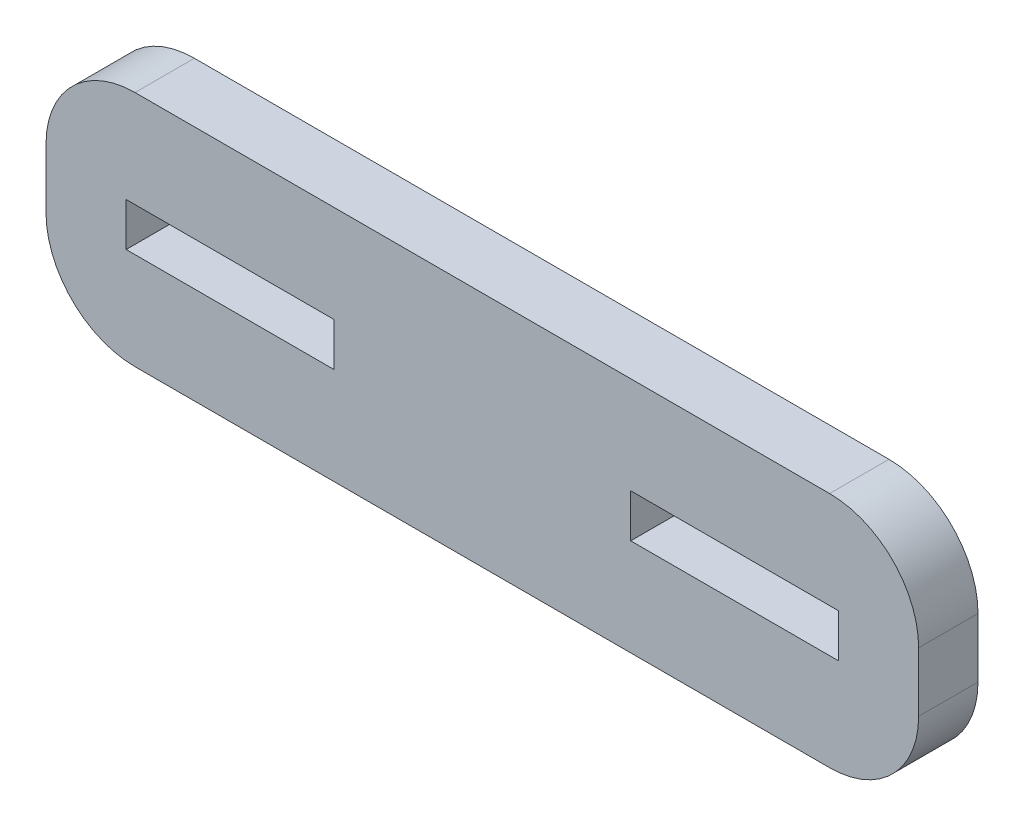
ISO-10303-21;
HEADER;
FILE_DESCRIPTION(('STEP AP214'),'2;1');
FILE_NAME('part.step','',(''),(''),'','','');
FILE_SCHEMA(('AUTOMOTIVE_DESIGN { 1 0 10303 214 1 1 1 1 }'));
ENDSEC;
DATA;
#1=APPLICATION_CONTEXT('core data for automotive mechanical design processes');
#2=APPLICATION_PROTOCOL_DEFINITION('international standard','automotive_design',2000,#1);
#3=PRODUCT_CONTEXT('',#1,'mechanical');
#4=PRODUCT('Part','Part','',(#3));
#5=PRODUCT_RELATED_PRODUCT_CATEGORY('part','',(#4));
#6=PRODUCT_DEFINITION_FORMATION('','',#4);
#7=PRODUCT_DEFINITION_CONTEXT('part definition',#1,'design');
#8=PRODUCT_DEFINITION('design','',#6,#7);
#9=PRODUCT_DEFINITION_SHAPE('','',#8);
#10=(LENGTH_UNIT() NAMED_UNIT(*) SI_UNIT(.MILLI.,.METRE.));
#11=(NAMED_UNIT(*) PLANE_ANGLE_UNIT() SI_UNIT($,.RADIAN.));
#12=(NAMED_UNIT(*) SI_UNIT($,.STERADIAN.) SOLID_ANGLE_UNIT());
#13=UNCERTAINTY_MEASURE_WITH_UNIT(LENGTH_MEASURE(1.E-05),#10,'distance_accuracy_value','');
#14=(GEOMETRIC_REPRESENTATION_CONTEXT(3) GLOBAL_UNCERTAINTY_ASSIGNED_CONTEXT((#13)) GLOBAL_UNIT_ASSIGNED_CONTEXT((#10,
#11,#12)) REPRESENTATION_CONTEXT('',''));
#15=CARTESIAN_POINT('',(0.,0.,0.));
#16=DIRECTION('',(0.,0.,1.));
#17=DIRECTION('',(1.,0.,0.));
#18=AXIS2_PLACEMENT_3D('',#15,#16,#17);
#19=CARTESIAN_POINT('',(-7.66454497858933,24.7840098446599,2.));
#20=DIRECTION('',(0.,0.,-1.));
#21=DIRECTION('',(-1.,0.,0.));
#22=AXIS2_PLACEMENT_3D('',#19,#20,#21);
#23=PLANE('',#22);
#24=DIRECTION('',(0.,-1.,0.));
#25=VECTOR('',#24,1.);
#26=CARTESIAN_POINT('',(-31.3645449785893,24.5140098446599,2.));
#27=LINE('',#26,#25);
#28=CARTESIAN_POINT('',(-31.3645449785893,24.5140098446599,2.));
#29=VERTEX_POINT('',#28);
#30=CARTESIAN_POINT('',(-31.3645449785893,23.0540098446599,2.));
#31=VERTEX_POINT('',#30);
#32=EDGE_CURVE('E200',#29,#31,#27,.T.);
#33=ORIENTED_EDGE('',*,*,#32,.F.);
#34=DIRECTION('',(-1.,0.,0.));
#35=VECTOR('',#34,1.);
#36=CARTESIAN_POINT('',(-31.3645449785893,24.5140098446599,2.));
#37=LINE('',#36,#35);
#38=CARTESIAN_POINT('',(-24.3645449785893,24.5140098446599,2.));
#39=VERTEX_POINT('',#38);
#40=EDGE_CURVE('E211',#39,#29,#37,.T.);
#41=ORIENTED_EDGE('',*,*,#40,.F.);
#42=DIRECTION('',(0.,1.,0.));
#43=VECTOR('',#42,1.);
#44=CARTESIAN_POINT('',(-24.3645449785893,24.5140098446599,2.));
#45=LINE('',#44,#43);
#46=CARTESIAN_POINT('',(-24.3645449785893,23.0540098446599,2.));
#47=VERTEX_POINT('',#46);
#48=EDGE_CURVE('E207',#47,#39,#45,.T.);
#49=ORIENTED_EDGE('',*,*,#48,.F.);
#50=DIRECTION('',(1.,0.,0.));
#51=VECTOR('',#50,1.);
#52=CARTESIAN_POINT('',(-31.3645449785893,23.0540098446599,2.));
#53=LINE('',#52,#51);
#54=EDGE_CURVE('E203',#31,#47,#53,.T.);
#55=ORIENTED_EDGE('',*,*,#54,.F.);
#56=EDGE_LOOP('',(#33,#41,#49,#55));
#57=FACE_BOUND('',#56,.T.);
#58=CARTESIAN_POINT('',(-7.66454497858933,24.7840098446599,2.));
#59=DIRECTION('',(0.,0.,1.));
#60=DIRECTION('',(-1.,0.,0.));
#61=AXIS2_PLACEMENT_3D('',#58,#59,#60);
#62=CIRCLE('',#61,3.);
#63=CARTESIAN_POINT('',(-4.66454497858933,24.7840098446599,2.));
#64=VERTEX_POINT('',#63);
#65=CARTESIAN_POINT('',(-7.66454497858935,27.7840098446599,2.));
#66=VERTEX_POINT('',#65);
#67=EDGE_CURVE('E243',#64,#66,#62,.T.);
#68=ORIENTED_EDGE('',*,*,#67,.T.);
#69=DIRECTION('',(-1.,0.,0.));
#70=VECTOR('',#69,1.);
#71=CARTESIAN_POINT('',(-31.0645449785893,27.7840098446599,2.));
#72=LINE('',#71,#70);
#73=CARTESIAN_POINT('',(-31.0645449785893,27.7840098446599,2.));
#74=VERTEX_POINT('',#73);
#75=EDGE_CURVE('E247',#66,#74,#72,.T.);
#76=ORIENTED_EDGE('',*,*,#75,.T.);
#77=CARTESIAN_POINT('',(-31.0645449785893,24.7840098446599,2.));
#78=DIRECTION('',(0.,0.,1.));
#79=DIRECTION('',(1.,0.,0.));
#80=AXIS2_PLACEMENT_3D('',#77,#78,#79);
#81=CIRCLE('',#80,3.);
#82=CARTESIAN_POINT('',(-34.0645449785893,24.7840098446599,2.));
#83=VERTEX_POINT('',#82);
#84=EDGE_CURVE('E251',#74,#83,#81,.T.);
#85=ORIENTED_EDGE('',*,*,#84,.T.);
#86=DIRECTION('',(0.,-1.,0.));
#87=VECTOR('',#86,1.);
#88=CARTESIAN_POINT('',(-34.0645449785893,24.7840098446599,2.));
#89=LINE('',#88,#87);
#90=CARTESIAN_POINT('',(-34.0645449785893,22.7840098446599,2.));
#91=VERTEX_POINT('',#90);
#92=EDGE_CURVE('E254',#83,#91,#89,.T.);
#93=ORIENTED_EDGE('',*,*,#92,.T.);
#94=CARTESIAN_POINT('',(-31.0645449785893,22.7840098446599,2.));
#95=DIRECTION('',(0.,0.,1.));
#96=DIRECTION('',(1.,0.,0.));
#97=AXIS2_PLACEMENT_3D('',#94,#95,#96);
#98=CIRCLE('',#97,3.);
#99=CARTESIAN_POINT('',(-31.0645449785893,19.7840098446599,2.));
#100=VERTEX_POINT('',#99);
#101=EDGE_CURVE('E257',#91,#100,#98,.T.);
#102=ORIENTED_EDGE('',*,*,#101,.T.);
#103=DIRECTION('',(1.,0.,0.));
#104=VECTOR('',#103,1.);
#105=CARTESIAN_POINT('',(-31.0645449785893,19.7840098446599,2.));
#106=LINE('',#105,#104);
#107=CARTESIAN_POINT('',(-7.66454497858935,19.7840098446599,2.));
#108=VERTEX_POINT('',#107);
#109=EDGE_CURVE('E260',#100,#108,#106,.T.);
#110=ORIENTED_EDGE('',*,*,#109,.T.);
#111=CARTESIAN_POINT('',(-7.66454497858933,22.7840098446599,2.));
#112=DIRECTION('',(0.,0.,1.));
#113=DIRECTION('',(1.,0.,0.));
#114=AXIS2_PLACEMENT_3D('',#111,#112,#113);
#115=CIRCLE('',#114,3.);
#116=CARTESIAN_POINT('',(-4.66454497858933,22.7840098446599,2.));
#117=VERTEX_POINT('',#116);
#118=EDGE_CURVE('E263',#108,#117,#115,.T.);
#119=ORIENTED_EDGE('',*,*,#118,.T.);
#120=DIRECTION('',(0.,1.,0.));
#121=VECTOR('',#120,1.);
#122=CARTESIAN_POINT('',(-4.66454497858933,24.7840098446599,2.));
#123=LINE('',#122,#121);
#124=EDGE_CURVE('E266',#117,#64,#123,.T.);
#125=ORIENTED_EDGE('',*,*,#124,.T.);
#126=EDGE_LOOP('',(#68,#76,#85,#93,#102,#110,#119,#125));
#127=FACE_BOUND('',#126,.T.);
#128=DIRECTION('',(0.,-1.,0.));
#129=VECTOR('',#128,1.);
#130=CARTESIAN_POINT('',(-14.3645449785893,24.5140098446599,2.));
#131=LINE('',#130,#129);
#132=CARTESIAN_POINT('',(-14.3645449785893,24.5140098446599,2.));
#133=VERTEX_POINT('',#132);
#134=CARTESIAN_POINT('',(-14.3645449785893,23.0540098446599,2.));
#135=VERTEX_POINT('',#134);
#136=EDGE_CURVE('E152',#133,#135,#131,.T.);
#137=ORIENTED_EDGE('',*,*,#136,.F.);
#138=DIRECTION('',(-1.,0.,0.));
#139=VECTOR('',#138,1.);
#140=CARTESIAN_POINT('',(-14.3645449785893,24.5140098446599,2.));
#141=LINE('',#140,#139);
#142=CARTESIAN_POINT('',(-7.36454497858933,24.5140098446599,2.));
#143=VERTEX_POINT('',#142);
#144=EDGE_CURVE('E178',#143,#133,#141,.T.);
#145=ORIENTED_EDGE('',*,*,#144,.F.);
#146=DIRECTION('',(0.,1.,0.));
#147=VECTOR('',#146,1.);
#148=CARTESIAN_POINT('',(-7.36454497858933,24.5140098446599,2.));
#149=LINE('',#148,#147);
#150=CARTESIAN_POINT('',(-7.36454497858933,23.0540098446599,2.));
#151=VERTEX_POINT('',#150);
#152=EDGE_CURVE('E174',#151,#143,#149,.T.);
#153=ORIENTED_EDGE('',*,*,#152,.F.);
#154=DIRECTION('',(1.,0.,0.));
#155=VECTOR('',#154,1.);
#156=CARTESIAN_POINT('',(-14.3645449785893,23.0540098446599,2.));
#157=LINE('',#156,#155);
#158=EDGE_CURVE('E161',#135,#151,#157,.T.);
#159=ORIENTED_EDGE('',*,*,#158,.F.);
#160=EDGE_LOOP('',(#137,#145,#153,#159));
#161=FACE_BOUND('',#160,.T.);
#162=ADVANCED_FACE('F38',(#57,#127,#161),#23,.F.);
#163=CARTESIAN_POINT('',(-7.66454497858933,24.7840098446599,0.));
#164=DIRECTION('',(0.,0.,-1.));
#165=DIRECTION('',(-1.,0.,0.));
#166=AXIS2_PLACEMENT_3D('',#163,#164,#165);
#167=PLANE('',#166);
#168=CARTESIAN_POINT('',(-7.66454497858933,24.7840098446599,0.));
#169=DIRECTION('',(0.,0.,1.));
#170=DIRECTION('',(-1.,0.,0.));
#171=AXIS2_PLACEMENT_3D('',#168,#169,#170);
#172=CIRCLE('',#171,3.);
#173=CARTESIAN_POINT('',(-4.66454497858933,24.7840098446599,0.));
#174=VERTEX_POINT('',#173);
#175=CARTESIAN_POINT('',(-7.66454497858935,27.7840098446599,0.));
#176=VERTEX_POINT('',#175);
#177=EDGE_CURVE('E242',#174,#176,#172,.T.);
#178=ORIENTED_EDGE('',*,*,#177,.F.);
#179=DIRECTION('',(0.,1.,0.));
#180=VECTOR('',#179,1.);
#181=CARTESIAN_POINT('',(-4.66454497858933,24.7840098446599,0.));
#182=LINE('',#181,#180);
#183=CARTESIAN_POINT('',(-4.66454497858933,22.7840098446599,0.));
#184=VERTEX_POINT('',#183);
#185=EDGE_CURVE('E248',#184,#174,#182,.T.);
#186=ORIENTED_EDGE('',*,*,#185,.F.);
#187=CARTESIAN_POINT('',(-7.66454497858933,22.7840098446599,0.));
#188=DIRECTION('',(0.,0.,1.));
#189=DIRECTION('',(1.,0.,0.));
#190=AXIS2_PLACEMENT_3D('',#187,#188,#189);
#191=CIRCLE('',#190,3.);
#192=CARTESIAN_POINT('',(-7.66454497858935,19.7840098446599,0.));
#193=VERTEX_POINT('',#192);
#194=EDGE_CURVE('E288',#193,#184,#191,.T.);
#195=ORIENTED_EDGE('',*,*,#194,.F.);
#196=DIRECTION('',(1.,0.,0.));
#197=VECTOR('',#196,1.);
#198=CARTESIAN_POINT('',(-31.0645449785893,19.7840098446599,0.));
#199=LINE('',#198,#197);
#200=CARTESIAN_POINT('',(-31.0645449785893,19.7840098446599,0.));
#201=VERTEX_POINT('',#200);
#202=EDGE_CURVE('E285',#201,#193,#199,.T.);
#203=ORIENTED_EDGE('',*,*,#202,.F.);
#204=CARTESIAN_POINT('',(-31.0645449785893,22.7840098446599,0.));
#205=DIRECTION('',(0.,0.,1.));
#206=DIRECTION('',(1.,0.,0.));
#207=AXIS2_PLACEMENT_3D('',#204,#205,#206);
#208=CIRCLE('',#207,3.);
#209=CARTESIAN_POINT('',(-34.0645449785893,22.7840098446599,0.));
#210=VERTEX_POINT('',#209);
#211=EDGE_CURVE('E282',#210,#201,#208,.T.);
#212=ORIENTED_EDGE('',*,*,#211,.F.);
#213=DIRECTION('',(0.,-1.,0.));
#214=VECTOR('',#213,1.);
#215=CARTESIAN_POINT('',(-34.0645449785893,24.7840098446599,0.));
#216=LINE('',#215,#214);
#217=CARTESIAN_POINT('',(-34.0645449785893,24.7840098446599,0.));
#218=VERTEX_POINT('',#217);
#219=EDGE_CURVE('E279',#218,#210,#216,.T.);
#220=ORIENTED_EDGE('',*,*,#219,.F.);
#221=CARTESIAN_POINT('',(-31.0645449785893,24.7840098446599,0.));
#222=DIRECTION('',(0.,0.,1.));
#223=DIRECTION('',(1.,0.,0.));
#224=AXIS2_PLACEMENT_3D('',#221,#222,#223);
#225=CIRCLE('',#224,3.);
#226=CARTESIAN_POINT('',(-31.0645449785893,27.7840098446599,0.));
#227=VERTEX_POINT('',#226);
#228=EDGE_CURVE('E276',#227,#218,#225,.T.);
#229=ORIENTED_EDGE('',*,*,#228,.F.);
#230=DIRECTION('',(-1.,0.,0.));
#231=VECTOR('',#230,1.);
#232=CARTESIAN_POINT('',(-31.0645449785893,27.7840098446599,0.));
#233=LINE('',#232,#231);
#234=EDGE_CURVE('E273',#176,#227,#233,.T.);
#235=ORIENTED_EDGE('',*,*,#234,.F.);
#236=EDGE_LOOP('',(#178,#186,#195,#203,#212,#220,#229,#235));
#237=FACE_BOUND('',#236,.T.);
#238=DIRECTION('',(-1.,0.,0.));
#239=VECTOR('',#238,1.);
#240=CARTESIAN_POINT('',(-31.3645449785893,24.5140098446599,0.));
#241=LINE('',#240,#239);
#242=CARTESIAN_POINT('',(-24.3645449785893,24.5140098446599,0.));
#243=VERTEX_POINT('',#242);
#244=CARTESIAN_POINT('',(-31.3645449785893,24.5140098446599,0.));
#245=VERTEX_POINT('',#244);
#246=EDGE_CURVE('E204',#243,#245,#241,.T.);
#247=ORIENTED_EDGE('',*,*,#246,.T.);
#248=DIRECTION('',(0.,-1.,0.));
#249=VECTOR('',#248,1.);
#250=CARTESIAN_POINT('',(-31.3645449785893,24.5140098446599,0.));
#251=LINE('',#250,#249);
#252=CARTESIAN_POINT('',(-31.3645449785893,23.0540098446599,0.));
#253=VERTEX_POINT('',#252);
#254=EDGE_CURVE('E170',#245,#253,#251,.T.);
#255=ORIENTED_EDGE('',*,*,#254,.T.);
#256=DIRECTION('',(1.,0.,0.));
#257=VECTOR('',#256,1.);
#258=CARTESIAN_POINT('',(-31.3645449785893,23.0540098446599,0.));
#259=LINE('',#258,#257);
#260=CARTESIAN_POINT('',(-24.3645449785893,23.0540098446599,0.));
#261=VERTEX_POINT('',#260);
#262=EDGE_CURVE('E218',#253,#261,#259,.T.);
#263=ORIENTED_EDGE('',*,*,#262,.T.);
#264=DIRECTION('',(0.,1.,0.));
#265=VECTOR('',#264,1.);
#266=CARTESIAN_POINT('',(-24.3645449785893,24.5140098446599,0.));
#267=LINE('',#266,#265);
#268=EDGE_CURVE('E222',#261,#243,#267,.T.);
#269=ORIENTED_EDGE('',*,*,#268,.T.);
#270=EDGE_LOOP('',(#247,#255,#263,#269));
#271=FACE_BOUND('',#270,.T.);
#272=DIRECTION('',(-1.,0.,0.));
#273=VECTOR('',#272,1.);
#274=CARTESIAN_POINT('',(-14.3645449785893,24.5140098446599,0.));
#275=LINE('',#274,#273);
#276=CARTESIAN_POINT('',(-7.36454497858933,24.5140098446599,0.));
#277=VERTEX_POINT('',#276);
#278=CARTESIAN_POINT('',(-14.3645449785893,24.5140098446599,0.));
#279=VERTEX_POINT('',#278);
#280=EDGE_CURVE('E162',#277,#279,#275,.T.);
#281=ORIENTED_EDGE('',*,*,#280,.T.);
#282=DIRECTION('',(0.,-1.,0.));
#283=VECTOR('',#282,1.);
#284=CARTESIAN_POINT('',(-14.3645449785893,24.5140098446599,0.));
#285=LINE('',#284,#283);
#286=CARTESIAN_POINT('',(-14.3645449785893,23.0540098446599,0.));
#287=VERTEX_POINT('',#286);
#288=EDGE_CURVE('E62',#279,#287,#285,.T.);
#289=ORIENTED_EDGE('',*,*,#288,.T.);
#290=DIRECTION('',(1.,0.,0.));
#291=VECTOR('',#290,1.);
#292=CARTESIAN_POINT('',(-14.3645449785893,23.0540098446599,0.));
#293=LINE('',#292,#291);
#294=CARTESIAN_POINT('',(-7.36454497858933,23.0540098446599,0.));
#295=VERTEX_POINT('',#294);
#296=EDGE_CURVE('E168',#287,#295,#293,.T.);
#297=ORIENTED_EDGE('',*,*,#296,.T.);
#298=DIRECTION('',(0.,1.,0.));
#299=VECTOR('',#298,1.);
#300=CARTESIAN_POINT('',(-7.36454497858933,24.5140098446599,0.));
#301=LINE('',#300,#299);
#302=EDGE_CURVE('E187',#295,#277,#301,.T.);
#303=ORIENTED_EDGE('',*,*,#302,.T.);
#304=EDGE_LOOP('',(#281,#289,#297,#303));
#305=FACE_BOUND('',#304,.T.);
#306=ADVANCED_FACE('F327',(#237,#271,#305),#167,.T.);
#307=CARTESIAN_POINT('',(-7.66454497858933,24.7840098446599,2.));
#308=DIRECTION('',(0.,0.,-1.));
#309=DIRECTION('',(-1.,0.,0.));
#310=AXIS2_PLACEMENT_3D('',#307,#308,#309);
#311=CYLINDRICAL_SURFACE('',#310,3.);
#312=ORIENTED_EDGE('',*,*,#177,.T.);
#313=DIRECTION('',(0.,0.,-1.));
#314=VECTOR('',#313,1.);
#315=CARTESIAN_POINT('',(-7.66454497858935,27.7840098446599,2.));
#316=LINE('',#315,#314);
#317=EDGE_CURVE('E11',#66,#176,#316,.T.);
#318=ORIENTED_EDGE('',*,*,#317,.F.);
#319=ORIENTED_EDGE('',*,*,#67,.F.);
#320=DIRECTION('',(0.,0.,-1.));
#321=VECTOR('',#320,1.);
#322=CARTESIAN_POINT('',(-4.66454497858933,24.7840098446599,2.));
#323=LINE('',#322,#321);
#324=EDGE_CURVE('E269',#64,#174,#323,.T.);
#325=ORIENTED_EDGE('',*,*,#324,.T.);
#326=EDGE_LOOP('',(#312,#318,#319,#325));
#327=FACE_BOUND('',#326,.T.);
#328=ADVANCED_FACE('F40',(#327),#311,.T.);
#329=CARTESIAN_POINT('',(-31.0645449785893,27.7840098446599,2.));
#330=DIRECTION('',(0.,-1.,0.));
#331=DIRECTION('',(0.,0.,-1.));
#332=AXIS2_PLACEMENT_3D('',#329,#330,#331);
#333=PLANE('',#332);
#334=ORIENTED_EDGE('',*,*,#234,.T.);
#335=DIRECTION('',(0.,0.,-1.));
#336=VECTOR('',#335,1.);
#337=CARTESIAN_POINT('',(-31.0645449785893,27.7840098446599,2.));
#338=LINE('',#337,#336);
#339=EDGE_CURVE('E47',#74,#227,#338,.T.);
#340=ORIENTED_EDGE('',*,*,#339,.F.);
#341=ORIENTED_EDGE('',*,*,#75,.F.);
#342=ORIENTED_EDGE('',*,*,#317,.T.);
#343=EDGE_LOOP('',(#334,#340,#341,#342));
#344=FACE_BOUND('',#343,.T.);
#345=ADVANCED_FACE('F344',(#344),#333,.F.);
#346=CARTESIAN_POINT('',(-31.0645449785893,24.7840098446599,2.));
#347=DIRECTION('',(0.,0.,-1.));
#348=DIRECTION('',(-1.,0.,0.));
#349=AXIS2_PLACEMENT_3D('',#346,#347,#348);
#350=CYLINDRICAL_SURFACE('',#349,3.);
#351=ORIENTED_EDGE('',*,*,#228,.T.);
#352=DIRECTION('',(0.,0.,-1.));
#353=VECTOR('',#352,1.);
#354=CARTESIAN_POINT('',(-34.0645449785893,24.7840098446599,2.));
#355=LINE('',#354,#353);
#356=EDGE_CURVE('E312',#83,#218,#355,.T.);
#357=ORIENTED_EDGE('',*,*,#356,.F.);
#358=ORIENTED_EDGE('',*,*,#84,.F.);
#359=ORIENTED_EDGE('',*,*,#339,.T.);
#360=EDGE_LOOP('',(#351,#357,#358,#359));
#361=FACE_BOUND('',#360,.T.);
#362=ADVANCED_FACE('F321',(#361),#350,.T.);
#363=CARTESIAN_POINT('',(-34.0645449785893,24.7840098446599,2.));
#364=DIRECTION('',(1.,0.,0.));
#365=DIRECTION('',(0.,0.,-1.));
#366=AXIS2_PLACEMENT_3D('',#363,#364,#365);
#367=PLANE('',#366);
#368=ORIENTED_EDGE('',*,*,#219,.T.);
#369=DIRECTION('',(0.,0.,-1.));
#370=VECTOR('',#369,1.);
#371=CARTESIAN_POINT('',(-34.0645449785893,22.7840098446599,2.));
#372=LINE('',#371,#370);
#373=EDGE_CURVE('E308',#91,#210,#372,.T.);
#374=ORIENTED_EDGE('',*,*,#373,.F.);
#375=ORIENTED_EDGE('',*,*,#92,.F.);
#376=ORIENTED_EDGE('',*,*,#356,.T.);
#377=EDGE_LOOP('',(#368,#374,#375,#376));
#378=FACE_BOUND('',#377,.T.);
#379=ADVANCED_FACE('F333',(#378),#367,.F.);
#380=CARTESIAN_POINT('',(-31.0645449785893,22.7840098446599,2.));
#381=DIRECTION('',(0.,0.,-1.));
#382=DIRECTION('',(-1.,0.,0.));
#383=AXIS2_PLACEMENT_3D('',#380,#381,#382);
#384=CYLINDRICAL_SURFACE('',#383,3.);
#385=ORIENTED_EDGE('',*,*,#211,.T.);
#386=DIRECTION('',(0.,0.,-1.));
#387=VECTOR('',#386,1.);
#388=CARTESIAN_POINT('',(-31.0645449785893,19.7840098446599,2.));
#389=LINE('',#388,#387);
#390=EDGE_CURVE('E304',#100,#201,#389,.T.);
#391=ORIENTED_EDGE('',*,*,#390,.F.);
#392=ORIENTED_EDGE('',*,*,#101,.F.);
#393=ORIENTED_EDGE('',*,*,#373,.T.);
#394=EDGE_LOOP('',(#385,#391,#392,#393));
#395=FACE_BOUND('',#394,.T.);
#396=ADVANCED_FACE('F337',(#395),#384,.T.);
#397=CARTESIAN_POINT('',(-31.0645449785893,19.7840098446599,2.));
#398=DIRECTION('',(0.,1.,0.));
#399=DIRECTION('',(0.,0.,1.));
#400=AXIS2_PLACEMENT_3D('',#397,#398,#399);
#401=PLANE('',#400);
#402=ORIENTED_EDGE('',*,*,#202,.T.);
#403=DIRECTION('',(0.,0.,-1.));
#404=VECTOR('',#403,1.);
#405=CARTESIAN_POINT('',(-7.66454497858935,19.7840098446599,2.));
#406=LINE('',#405,#404);
#407=EDGE_CURVE('E300',#108,#193,#406,.T.);
#408=ORIENTED_EDGE('',*,*,#407,.F.);
#409=ORIENTED_EDGE('',*,*,#109,.F.);
#410=ORIENTED_EDGE('',*,*,#390,.T.);
#411=EDGE_LOOP('',(#402,#408,#409,#410));
#412=FACE_BOUND('',#411,.T.);
#413=ADVANCED_FACE('F357',(#412),#401,.F.);
#414=CARTESIAN_POINT('',(-7.66454497858933,22.7840098446599,2.));
#415=DIRECTION('',(0.,0.,-1.));
#416=DIRECTION('',(-1.,0.,0.));
#417=AXIS2_PLACEMENT_3D('',#414,#415,#416);
#418=CYLINDRICAL_SURFACE('',#417,3.);
#419=ORIENTED_EDGE('',*,*,#194,.T.);
#420=DIRECTION('',(0.,0.,-1.));
#421=VECTOR('',#420,1.);
#422=CARTESIAN_POINT('',(-4.66454497858933,22.7840098446599,2.));
#423=LINE('',#422,#421);
#424=EDGE_CURVE('E296',#117,#184,#423,.T.);
#425=ORIENTED_EDGE('',*,*,#424,.F.);
#426=ORIENTED_EDGE('',*,*,#118,.F.);
#427=ORIENTED_EDGE('',*,*,#407,.T.);
#428=EDGE_LOOP('',(#419,#425,#426,#427));
#429=FACE_BOUND('',#428,.T.);
#430=ADVANCED_FACE('F355',(#429),#418,.T.);
#431=CARTESIAN_POINT('',(-4.66454497858933,24.7840098446599,2.));
#432=DIRECTION('',(-1.,0.,0.));
#433=DIRECTION('',(0.,0.,1.));
#434=AXIS2_PLACEMENT_3D('',#431,#432,#433);
#435=PLANE('',#434);
#436=ORIENTED_EDGE('',*,*,#185,.T.);
#437=ORIENTED_EDGE('',*,*,#324,.F.);
#438=ORIENTED_EDGE('',*,*,#124,.F.);
#439=ORIENTED_EDGE('',*,*,#424,.T.);
#440=EDGE_LOOP('',(#436,#437,#438,#439));
#441=FACE_BOUND('',#440,.T.);
#442=ADVANCED_FACE('F350',(#441),#435,.F.);
#443=CARTESIAN_POINT('',(-31.3645449785893,24.5140098446599,2.));
#444=DIRECTION('',(1.,0.,0.));
#445=DIRECTION('',(0.,0.,-1.));
#446=AXIS2_PLACEMENT_3D('',#443,#444,#445);
#447=PLANE('',#446);
#448=ORIENTED_EDGE('',*,*,#254,.F.);
#449=DIRECTION('',(0.,0.,-1.));
#450=VECTOR('',#449,1.);
#451=CARTESIAN_POINT('',(-31.3645449785893,24.5140098446599,2.));
#452=LINE('',#451,#450);
#453=EDGE_CURVE('E214',#29,#245,#452,.T.);
#454=ORIENTED_EDGE('',*,*,#453,.F.);
#455=ORIENTED_EDGE('',*,*,#32,.T.);
#456=DIRECTION('',(0.,0.,-1.));
#457=VECTOR('',#456,1.);
#458=CARTESIAN_POINT('',(-31.3645449785893,23.0540098446599,2.));
#459=LINE('',#458,#457);
#460=EDGE_CURVE('E238',#31,#253,#459,.T.);
#461=ORIENTED_EDGE('',*,*,#460,.T.);
#462=EDGE_LOOP('',(#448,#454,#455,#461));
#463=FACE_BOUND('',#462,.T.);
#464=ADVANCED_FACE('F375',(#463),#447,.T.);
#465=CARTESIAN_POINT('',(-31.3645449785893,23.0540098446599,2.));
#466=DIRECTION('',(0.,1.,0.));
#467=DIRECTION('',(0.,0.,1.));
#468=AXIS2_PLACEMENT_3D('',#465,#466,#467);
#469=PLANE('',#468);
#470=ORIENTED_EDGE('',*,*,#262,.F.);
#471=ORIENTED_EDGE('',*,*,#460,.F.);
#472=ORIENTED_EDGE('',*,*,#54,.T.);
#473=DIRECTION('',(0.,0.,-1.));
#474=VECTOR('',#473,1.);
#475=CARTESIAN_POINT('',(-24.3645449785893,23.0540098446599,2.));
#476=LINE('',#475,#474);
#477=EDGE_CURVE('E235',#47,#261,#476,.T.);
#478=ORIENTED_EDGE('',*,*,#477,.T.);
#479=EDGE_LOOP('',(#470,#471,#472,#478));
#480=FACE_BOUND('',#479,.T.);
#481=ADVANCED_FACE('F382',(#480),#469,.T.);
#482=CARTESIAN_POINT('',(-24.3645449785893,24.5140098446599,2.));
#483=DIRECTION('',(-1.,0.,0.));
#484=DIRECTION('',(0.,0.,1.));
#485=AXIS2_PLACEMENT_3D('',#482,#483,#484);
#486=PLANE('',#485);
#487=ORIENTED_EDGE('',*,*,#268,.F.);
#488=ORIENTED_EDGE('',*,*,#477,.F.);
#489=ORIENTED_EDGE('',*,*,#48,.T.);
#490=DIRECTION('',(0.,0.,-1.));
#491=VECTOR('',#490,1.);
#492=CARTESIAN_POINT('',(-24.3645449785893,24.5140098446599,2.));
#493=LINE('',#492,#491);
#494=EDGE_CURVE('E232',#39,#243,#493,.T.);
#495=ORIENTED_EDGE('',*,*,#494,.T.);
#496=EDGE_LOOP('',(#487,#488,#489,#495));
#497=FACE_BOUND('',#496,.T.);
#498=ADVANCED_FACE('F387',(#497),#486,.T.);
#499=CARTESIAN_POINT('',(-31.3645449785893,24.5140098446599,2.));
#500=DIRECTION('',(0.,-1.,0.));
#501=DIRECTION('',(0.,0.,-1.));
#502=AXIS2_PLACEMENT_3D('',#499,#500,#501);
#503=PLANE('',#502);
#504=ORIENTED_EDGE('',*,*,#246,.F.);
#505=ORIENTED_EDGE('',*,*,#494,.F.);
#506=ORIENTED_EDGE('',*,*,#40,.T.);
#507=ORIENTED_EDGE('',*,*,#453,.T.);
#508=EDGE_LOOP('',(#504,#505,#506,#507));
#509=FACE_BOUND('',#508,.T.);
#510=ADVANCED_FACE('F393',(#509),#503,.T.);
#511=CARTESIAN_POINT('',(-14.3645449785893,24.5140098446599,2.));
#512=DIRECTION('',(1.,0.,0.));
#513=DIRECTION('',(0.,0.,-1.));
#514=AXIS2_PLACEMENT_3D('',#511,#512,#513);
#515=PLANE('',#514);
#516=ORIENTED_EDGE('',*,*,#288,.F.);
#517=DIRECTION('',(0.,0.,-1.));
#518=VECTOR('',#517,1.);
#519=CARTESIAN_POINT('',(-14.3645449785893,24.5140098446599,2.));
#520=LINE('',#519,#518);
#521=EDGE_CURVE('E156',#133,#279,#520,.T.);
#522=ORIENTED_EDGE('',*,*,#521,.F.);
#523=ORIENTED_EDGE('',*,*,#136,.T.);
#524=DIRECTION('',(0.,0.,-1.));
#525=VECTOR('',#524,1.);
#526=CARTESIAN_POINT('',(-14.3645449785893,23.0540098446599,2.));
#527=LINE('',#526,#525);
#528=EDGE_CURVE('E155',#135,#287,#527,.T.);
#529=ORIENTED_EDGE('',*,*,#528,.T.);
#530=EDGE_LOOP('',(#516,#522,#523,#529));
#531=FACE_BOUND('',#530,.T.);
#532=ADVANCED_FACE('F154',(#531),#515,.T.);
#533=CARTESIAN_POINT('',(-14.3645449785893,23.0540098446599,2.));
#534=DIRECTION('',(0.,1.,0.));
#535=DIRECTION('',(0.,0.,1.));
#536=AXIS2_PLACEMENT_3D('',#533,#534,#535);
#537=PLANE('',#536);
#538=ORIENTED_EDGE('',*,*,#296,.F.);
#539=ORIENTED_EDGE('',*,*,#528,.F.);
#540=ORIENTED_EDGE('',*,*,#158,.T.);
#541=DIRECTION('',(0.,0.,-1.));
#542=VECTOR('',#541,1.);
#543=CARTESIAN_POINT('',(-7.36454497858933,23.0540098446599,2.));
#544=LINE('',#543,#542);
#545=EDGE_CURVE('E171',#151,#295,#544,.T.);
#546=ORIENTED_EDGE('',*,*,#545,.T.);
#547=EDGE_LOOP('',(#538,#539,#540,#546));
#548=FACE_BOUND('',#547,.T.);
#549=ADVANCED_FACE('F165',(#548),#537,.T.);
#550=CARTESIAN_POINT('',(-7.36454497858933,24.5140098446599,2.));
#551=DIRECTION('',(-1.,0.,0.));
#552=DIRECTION('',(0.,0.,1.));
#553=AXIS2_PLACEMENT_3D('',#550,#551,#552);
#554=PLANE('',#553);
#555=ORIENTED_EDGE('',*,*,#302,.F.);
#556=ORIENTED_EDGE('',*,*,#545,.F.);
#557=ORIENTED_EDGE('',*,*,#152,.T.);
#558=DIRECTION('',(0.,0.,-1.));
#559=VECTOR('',#558,1.);
#560=CARTESIAN_POINT('',(-7.36454497858933,24.5140098446599,2.));
#561=LINE('',#560,#559);
#562=EDGE_CURVE('E54',#143,#277,#561,.T.);
#563=ORIENTED_EDGE('',*,*,#562,.T.);
#564=EDGE_LOOP('',(#555,#556,#557,#563));
#565=FACE_BOUND('',#564,.T.);
#566=ADVANCED_FACE('F412',(#565),#554,.T.);
#567=CARTESIAN_POINT('',(-14.3645449785893,24.5140098446599,2.));
#568=DIRECTION('',(0.,-1.,0.));
#569=DIRECTION('',(0.,0.,-1.));
#570=AXIS2_PLACEMENT_3D('',#567,#568,#569);
#571=PLANE('',#570);
#572=ORIENTED_EDGE('',*,*,#280,.F.);
#573=ORIENTED_EDGE('',*,*,#562,.F.);
#574=ORIENTED_EDGE('',*,*,#144,.T.);
#575=ORIENTED_EDGE('',*,*,#521,.T.);
#576=EDGE_LOOP('',(#572,#573,#574,#575));
#577=FACE_BOUND('',#576,.T.);
#578=ADVANCED_FACE('F415',(#577),#571,.T.);
#579=CLOSED_SHELL('',(#162,#306,#328,#345,#362,#379,#396,#413,#430,#442,#464,#481,#498,#510,
#532,#549,#566,#578));
#580=MANIFOLD_SOLID_BREP('B2',#579);
#581=ADVANCED_BREP_SHAPE_REPRESENTATION('',(#18,#580),#14);
#582=SHAPE_DEFINITION_REPRESENTATION(#9,#581);
ENDSEC;
END-ISO-10303-21;
